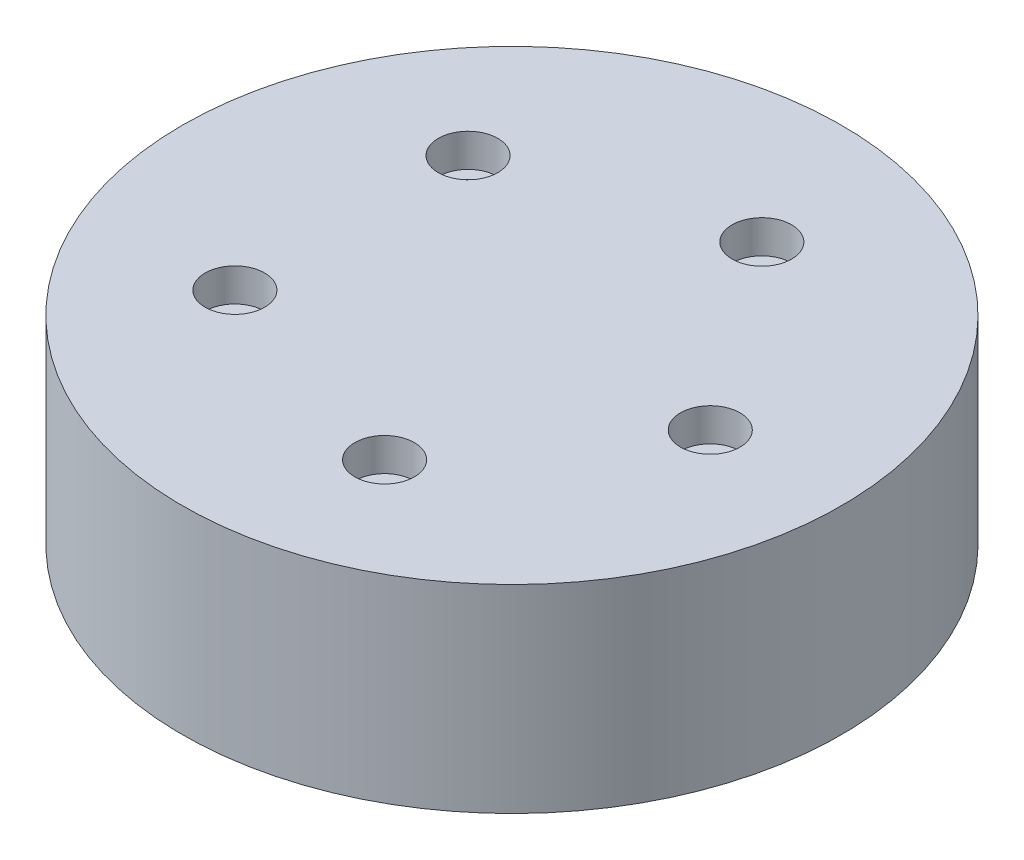
ISO-10303-21;
HEADER;
FILE_DESCRIPTION(('STEP AP214'),'2;1');
FILE_NAME('part.step','',(''),(''),'','','');
FILE_SCHEMA(('AUTOMOTIVE_DESIGN { 1 0 10303 214 1 1 1 1 }'));
ENDSEC;
DATA;
#1=APPLICATION_CONTEXT('core data for automotive mechanical design processes');
#2=APPLICATION_PROTOCOL_DEFINITION('international standard','automotive_design',2000,#1);
#3=PRODUCT_CONTEXT('',#1,'mechanical');
#4=PRODUCT('Part','Part','',(#3));
#5=PRODUCT_RELATED_PRODUCT_CATEGORY('part','',(#4));
#6=PRODUCT_DEFINITION_FORMATION('','',#4);
#7=PRODUCT_DEFINITION_CONTEXT('part definition',#1,'design');
#8=PRODUCT_DEFINITION('design','',#6,#7);
#9=PRODUCT_DEFINITION_SHAPE('','',#8);
#10=(LENGTH_UNIT() NAMED_UNIT(*) SI_UNIT(.MILLI.,.METRE.));
#11=(NAMED_UNIT(*) PLANE_ANGLE_UNIT() SI_UNIT($,.RADIAN.));
#12=(NAMED_UNIT(*) SI_UNIT($,.STERADIAN.) SOLID_ANGLE_UNIT());
#13=UNCERTAINTY_MEASURE_WITH_UNIT(LENGTH_MEASURE(1.E-05),#10,'distance_accuracy_value','');
#14=(GEOMETRIC_REPRESENTATION_CONTEXT(3) GLOBAL_UNCERTAINTY_ASSIGNED_CONTEXT((#13)) GLOBAL_UNIT_ASSIGNED_CONTEXT((#10,
#11,#12)) REPRESENTATION_CONTEXT('',''));
#15=CARTESIAN_POINT('',(0.,0.,0.));
#16=DIRECTION('',(0.,0.,1.));
#17=DIRECTION('',(1.,0.,0.));
#18=AXIS2_PLACEMENT_3D('',#15,#16,#17);
#19=CARTESIAN_POINT('',(3.4352549156516,5.,-14.265847744427));
#20=DIRECTION('',(0.,1.,0.));
#21=DIRECTION('',(-1.,0.,0.));
#22=AXIS2_PLACEMENT_3D('',#19,#20,#21);
#23=CYLINDRICAL_SURFACE('',#22,1.3);
#24=CARTESIAN_POINT('',(3.4352549156516,17.5,-14.265847744427));
#25=DIRECTION('',(0.,-1.,0.));
#26=DIRECTION('',(0.,0.,-1.));
#27=AXIS2_PLACEMENT_3D('',#24,#25,#26);
#28=CIRCLE('',#27,1.3);
#29=CARTESIAN_POINT('',(3.4352549156516,17.5,-15.565847744427));
#30=VERTEX_POINT('',#29);
#31=EDGE_CURVE('E78',#30,#30,#28,.F.);
#32=ORIENTED_EDGE('',*,*,#31,.T.);
#33=EDGE_LOOP('',(#32));
#34=FACE_BOUND('',#33,.T.);
#35=CARTESIAN_POINT('',(3.4352549156516,10.,-14.265847744427));
#36=DIRECTION('',(0.,-1.,0.));
#37=DIRECTION('',(1.,0.,0.));
#38=AXIS2_PLACEMENT_3D('',#35,#36,#37);
#39=CIRCLE('',#38,1.3);
#40=CARTESIAN_POINT('',(4.7352549156516,10.,-14.265847744427));
#41=VERTEX_POINT('',#40);
#42=EDGE_CURVE('E55',#41,#41,#39,.F.);
#43=ORIENTED_EDGE('',*,*,#42,.F.);
#44=EDGE_LOOP('',(#43));
#45=FACE_BOUND('',#44,.T.);
#46=ADVANCED_FACE('F39',(#34,#45),#23,.F.);
#47=CARTESIAN_POINT('',(13.8000000000276,5.,0.));
#48=DIRECTION('',(0.,1.,0.));
#49=DIRECTION('',(-1.,0.,0.));
#50=AXIS2_PLACEMENT_3D('',#47,#48,#49);
#51=CYLINDRICAL_SURFACE('',#50,1.3);
#52=CARTESIAN_POINT('',(13.8000000000276,17.5,0.));
#53=DIRECTION('',(0.,-1.,0.));
#54=DIRECTION('',(0.,0.,-1.));
#55=AXIS2_PLACEMENT_3D('',#52,#53,#54);
#56=CIRCLE('',#55,1.3);
#57=CARTESIAN_POINT('',(13.8000000000276,17.5,-1.3));
#58=VERTEX_POINT('',#57);
#59=EDGE_CURVE('E43',#58,#58,#56,.F.);
#60=ORIENTED_EDGE('',*,*,#59,.T.);
#61=EDGE_LOOP('',(#60));
#62=FACE_BOUND('',#61,.T.);
#63=CARTESIAN_POINT('',(13.8000000000276,10.,0.));
#64=DIRECTION('',(0.,-1.,0.));
#65=DIRECTION('',(1.,0.,0.));
#66=AXIS2_PLACEMENT_3D('',#63,#64,#65);
#67=CIRCLE('',#66,1.3);
#68=CARTESIAN_POINT('',(15.1000000000276,10.,0.));
#69=VERTEX_POINT('',#68);
#70=EDGE_CURVE('E66',#69,#69,#67,.F.);
#71=ORIENTED_EDGE('',*,*,#70,.F.);
#72=EDGE_LOOP('',(#71));
#73=FACE_BOUND('',#72,.T.);
#74=ADVANCED_FACE('F161',(#62,#73),#51,.F.);
#75=CARTESIAN_POINT('',(3.43525491565219,5.,14.2658477444276));
#76=DIRECTION('',(0.,1.,0.));
#77=DIRECTION('',(-1.,0.,0.));
#78=AXIS2_PLACEMENT_3D('',#75,#76,#77);
#79=CYLINDRICAL_SURFACE('',#78,1.3);
#80=CARTESIAN_POINT('',(3.4352549156522,17.5,14.2658477444276));
#81=DIRECTION('',(0.,-1.,0.));
#82=DIRECTION('',(0.,0.,-1.));
#83=AXIS2_PLACEMENT_3D('',#80,#81,#82);
#84=CIRCLE('',#83,1.3);
#85=CARTESIAN_POINT('',(3.4352549156522,17.5,12.9658477444276));
#86=VERTEX_POINT('',#85);
#87=EDGE_CURVE('E84',#86,#86,#84,.F.);
#88=ORIENTED_EDGE('',*,*,#87,.T.);
#89=EDGE_LOOP('',(#88));
#90=FACE_BOUND('',#89,.T.);
#91=CARTESIAN_POINT('',(3.43525491565219,10.,14.2658477444276));
#92=DIRECTION('',(0.,-1.,0.));
#93=DIRECTION('',(1.,0.,0.));
#94=AXIS2_PLACEMENT_3D('',#91,#92,#93);
#95=CIRCLE('',#94,1.3);
#96=CARTESIAN_POINT('',(4.73525491565219,10.,14.2658477444276));
#97=VERTEX_POINT('',#96);
#98=EDGE_CURVE('E62',#97,#97,#95,.F.);
#99=ORIENTED_EDGE('',*,*,#98,.F.);
#100=EDGE_LOOP('',(#99));
#101=FACE_BOUND('',#100,.T.);
#102=ADVANCED_FACE('F169',(#90,#101),#79,.F.);
#103=CARTESIAN_POINT('',(-13.3352549155966,5.,8.8167787843871));
#104=DIRECTION('',(0.,1.,0.));
#105=DIRECTION('',(-1.,0.,0.));
#106=AXIS2_PLACEMENT_3D('',#103,#104,#105);
#107=CYLINDRICAL_SURFACE('',#106,1.3);
#108=CARTESIAN_POINT('',(-13.3352549155966,17.5,8.8167787843871));
#109=DIRECTION('',(0.,-1.,0.));
#110=DIRECTION('',(0.,0.,-1.));
#111=AXIS2_PLACEMENT_3D('',#108,#109,#110);
#112=CIRCLE('',#111,1.3);
#113=CARTESIAN_POINT('',(-13.3352549155966,17.5,7.5167787843871));
#114=VERTEX_POINT('',#113);
#115=EDGE_CURVE('E81',#114,#114,#112,.F.);
#116=ORIENTED_EDGE('',*,*,#115,.T.);
#117=EDGE_LOOP('',(#116));
#118=FACE_BOUND('',#117,.T.);
#119=CARTESIAN_POINT('',(-13.3352549155966,10.,8.8167787843871));
#120=DIRECTION('',(0.,-1.,0.));
#121=DIRECTION('',(1.,0.,0.));
#122=AXIS2_PLACEMENT_3D('',#119,#120,#121);
#123=CIRCLE('',#122,1.3);
#124=CARTESIAN_POINT('',(-12.0352549155966,10.,8.8167787843871));
#125=VERTEX_POINT('',#124);
#126=EDGE_CURVE('E56',#125,#125,#123,.F.);
#127=ORIENTED_EDGE('',*,*,#126,.F.);
#128=EDGE_LOOP('',(#127));
#129=FACE_BOUND('',#128,.T.);
#130=ADVANCED_FACE('F175',(#118,#129),#107,.F.);
#131=CARTESIAN_POINT('',(-13.3352549155966,5.,-8.81677878438709));
#132=DIRECTION('',(0.,1.,0.));
#133=DIRECTION('',(-1.,0.,0.));
#134=AXIS2_PLACEMENT_3D('',#131,#132,#133);
#135=CYLINDRICAL_SURFACE('',#134,1.3);
#136=CARTESIAN_POINT('',(-13.3352549155966,17.5,-8.81677878438709));
#137=DIRECTION('',(0.,-1.,0.));
#138=DIRECTION('',(0.,0.,-1.));
#139=AXIS2_PLACEMENT_3D('',#136,#137,#138);
#140=CIRCLE('',#139,1.3);
#141=CARTESIAN_POINT('',(-13.3352549155966,17.5,-10.1167787843871));
#142=VERTEX_POINT('',#141);
#143=EDGE_CURVE('E72',#142,#142,#140,.F.);
#144=ORIENTED_EDGE('',*,*,#143,.T.);
#145=EDGE_LOOP('',(#144));
#146=FACE_BOUND('',#145,.T.);
#147=CARTESIAN_POINT('',(-13.3352549155966,10.,-8.81677878438709));
#148=DIRECTION('',(0.,-1.,0.));
#149=DIRECTION('',(1.,0.,0.));
#150=AXIS2_PLACEMENT_3D('',#147,#148,#149);
#151=CIRCLE('',#150,1.3);
#152=CARTESIAN_POINT('',(-12.0352549155966,10.,-8.81677878438709));
#153=VERTEX_POINT('',#152);
#154=EDGE_CURVE('E57',#153,#153,#151,.F.);
#155=ORIENTED_EDGE('',*,*,#154,.F.);
#156=EDGE_LOOP('',(#155));
#157=FACE_BOUND('',#156,.T.);
#158=ADVANCED_FACE('F41',(#146,#157),#135,.F.);
#159=CARTESIAN_POINT('',(-1.19999999997238,5.,0.));
#160=DIRECTION('',(0.,1.,0.));
#161=DIRECTION('',(-1.,0.,0.));
#162=AXIS2_PLACEMENT_3D('',#159,#160,#161);
#163=CYLINDRICAL_SURFACE('',#162,24.925);
#164=CARTESIAN_POINT('',(-1.19999999997238,5.,0.));
#165=DIRECTION('',(0.,1.,0.));
#166=DIRECTION('',(-1.,0.,0.));
#167=AXIS2_PLACEMENT_3D('',#164,#165,#166);
#168=CIRCLE('',#167,24.925);
#169=CARTESIAN_POINT('',(-26.1249999999724,5.,0.));
#170=VERTEX_POINT('',#169);
#171=EDGE_CURVE('E10',#170,#170,#168,.T.);
#172=ORIENTED_EDGE('',*,*,#171,.T.);
#173=EDGE_LOOP('',(#172));
#174=FACE_BOUND('',#173,.T.);
#175=CARTESIAN_POINT('',(-1.19999999997238,20.,0.));
#176=DIRECTION('',(0.,1.,0.));
#177=DIRECTION('',(-1.,0.,0.));
#178=AXIS2_PLACEMENT_3D('',#175,#176,#177);
#179=CIRCLE('',#178,24.925);
#180=CARTESIAN_POINT('',(-26.1249999999724,20.,0.));
#181=VERTEX_POINT('',#180);
#182=EDGE_CURVE('E50',#181,#181,#179,.T.);
#183=ORIENTED_EDGE('',*,*,#182,.F.);
#184=EDGE_LOOP('',(#183));
#185=FACE_BOUND('',#184,.T.);
#186=ADVANCED_FACE('F148',(#174,#185),#163,.T.);
#187=CARTESIAN_POINT('',(0.,5.,0.));
#188=DIRECTION('',(0.,1.,0.));
#189=DIRECTION('',(-1.,0.,0.));
#190=AXIS2_PLACEMENT_3D('',#187,#188,#189);
#191=PLANE('',#190);
#192=CARTESIAN_POINT('',(3.43525491574279,5.,-14.2658477443021));
#193=DIRECTION('',(0.,-1.,0.));
#194=DIRECTION('',(1.,0.,0.));
#195=AXIS2_PLACEMENT_3D('',#192,#193,#194);
#196=CIRCLE('',#195,1.65);
#197=CARTESIAN_POINT('',(5.08525491574279,5.,-14.2658477443021));
#198=VERTEX_POINT('',#197);
#199=EDGE_CURVE('E133',#198,#198,#196,.T.);
#200=ORIENTED_EDGE('',*,*,#199,.F.);
#201=EDGE_LOOP('',(#200));
#202=FACE_BOUND('',#201,.T.);
#203=CARTESIAN_POINT('',(-13.3352549153584,5.,-8.81677878430962));
#204=DIRECTION('',(0.,-1.,0.));
#205=DIRECTION('',(1.,0.,0.));
#206=AXIS2_PLACEMENT_3D('',#203,#204,#205);
#207=CIRCLE('',#206,1.65);
#208=CARTESIAN_POINT('',(-11.6852549153584,5.,-8.81677878430962));
#209=VERTEX_POINT('',#208);
#210=EDGE_CURVE('E124',#209,#209,#207,.T.);
#211=ORIENTED_EDGE('',*,*,#210,.F.);
#212=EDGE_LOOP('',(#211));
#213=FACE_BOUND('',#212,.T.);
#214=CARTESIAN_POINT('',(13.8000000000276,5.,0.));
#215=DIRECTION('',(0.,-1.,0.));
#216=DIRECTION('',(1.,0.,0.));
#217=AXIS2_PLACEMENT_3D('',#214,#215,#216);
#218=CIRCLE('',#217,1.65);
#219=CARTESIAN_POINT('',(15.4500000000276,5.,0.));
#220=VERTEX_POINT('',#219);
#221=EDGE_CURVE('E120',#220,#220,#218,.T.);
#222=ORIENTED_EDGE('',*,*,#221,.F.);
#223=EDGE_LOOP('',(#222));
#224=FACE_BOUND('',#223,.T.);
#225=CARTESIAN_POINT('',(3.43525491574299,5.,14.265847744302));
#226=DIRECTION('',(0.,-1.,0.));
#227=DIRECTION('',(1.,0.,0.));
#228=AXIS2_PLACEMENT_3D('',#225,#226,#227);
#229=CIRCLE('',#228,1.65);
#230=CARTESIAN_POINT('',(5.08525491574299,5.,14.265847744302));
#231=VERTEX_POINT('',#230);
#232=EDGE_CURVE('E115',#231,#231,#229,.T.);
#233=ORIENTED_EDGE('',*,*,#232,.F.);
#234=EDGE_LOOP('',(#233));
#235=FACE_BOUND('',#234,.T.);
#236=CARTESIAN_POINT('',(-13.3352549153583,5.,8.81677878430981));
#237=DIRECTION('',(0.,-1.,0.));
#238=DIRECTION('',(1.,0.,0.));
#239=AXIS2_PLACEMENT_3D('',#236,#237,#238);
#240=CIRCLE('',#239,1.65);
#241=CARTESIAN_POINT('',(-11.6852549153583,5.,8.81677878430981));
#242=VERTEX_POINT('',#241);
#243=EDGE_CURVE('E113',#242,#242,#240,.T.);
#244=ORIENTED_EDGE('',*,*,#243,.F.);
#245=EDGE_LOOP('',(#244));
#246=FACE_BOUND('',#245,.T.);
#247=ORIENTED_EDGE('',*,*,#171,.F.);
#248=EDGE_LOOP('',(#247));
#249=FACE_BOUND('',#248,.T.);
#250=ADVANCED_FACE('F142',(#202,#213,#224,#235,#246,#249),#191,.F.);
#251=CARTESIAN_POINT('',(0.,20.,0.));
#252=DIRECTION('',(0.,1.,0.));
#253=DIRECTION('',(-1.,0.,0.));
#254=AXIS2_PLACEMENT_3D('',#251,#252,#253);
#255=PLANE('',#254);
#256=CARTESIAN_POINT('',(13.8000000000276,20.,0.));
#257=DIRECTION('',(0.,1.,0.));
#258=DIRECTION('',(0.,0.,1.));
#259=AXIS2_PLACEMENT_3D('',#256,#257,#258);
#260=CIRCLE('',#259,2.25);
#261=CARTESIAN_POINT('',(13.8000000000276,20.,2.25));
#262=VERTEX_POINT('',#261);
#263=EDGE_CURVE('E269',#262,#262,#260,.T.);
#264=ORIENTED_EDGE('',*,*,#263,.F.);
#265=EDGE_LOOP('',(#264));
#266=FACE_BOUND('',#265,.T.);
#267=CARTESIAN_POINT('',(3.4352549156522,20.,14.2658477444276));
#268=DIRECTION('',(0.,1.,0.));
#269=DIRECTION('',(0.,0.,1.));
#270=AXIS2_PLACEMENT_3D('',#267,#268,#269);
#271=CIRCLE('',#270,2.25);
#272=CARTESIAN_POINT('',(3.4352549156522,20.,16.5158477444276));
#273=VERTEX_POINT('',#272);
#274=EDGE_CURVE('E94',#273,#273,#271,.T.);
#275=ORIENTED_EDGE('',*,*,#274,.F.);
#276=EDGE_LOOP('',(#275));
#277=FACE_BOUND('',#276,.T.);
#278=CARTESIAN_POINT('',(-13.3352549155966,20.,8.8167787843871));
#279=DIRECTION('',(0.,1.,0.));
#280=DIRECTION('',(0.,0.,1.));
#281=AXIS2_PLACEMENT_3D('',#278,#279,#280);
#282=CIRCLE('',#281,2.25);
#283=CARTESIAN_POINT('',(-13.3352549155966,20.,11.0667787843871));
#284=VERTEX_POINT('',#283);
#285=EDGE_CURVE('E87',#284,#284,#282,.T.);
#286=ORIENTED_EDGE('',*,*,#285,.F.);
#287=EDGE_LOOP('',(#286));
#288=FACE_BOUND('',#287,.T.);
#289=CARTESIAN_POINT('',(3.4352549156516,20.,-14.265847744427));
#290=DIRECTION('',(0.,1.,0.));
#291=DIRECTION('',(0.,0.,1.));
#292=AXIS2_PLACEMENT_3D('',#289,#290,#291);
#293=CIRCLE('',#292,2.25);
#294=CARTESIAN_POINT('',(3.4352549156516,20.,-12.015847744427));
#295=VERTEX_POINT('',#294);
#296=EDGE_CURVE('E83',#295,#295,#293,.T.);
#297=ORIENTED_EDGE('',*,*,#296,.F.);
#298=EDGE_LOOP('',(#297));
#299=FACE_BOUND('',#298,.T.);
#300=CARTESIAN_POINT('',(-13.3352549155966,20.,-8.81677878438709));
#301=DIRECTION('',(0.,1.,0.));
#302=DIRECTION('',(0.,0.,1.));
#303=AXIS2_PLACEMENT_3D('',#300,#301,#302);
#304=CIRCLE('',#303,2.25);
#305=CARTESIAN_POINT('',(-13.3352549155966,20.,-6.56677878438709));
#306=VERTEX_POINT('',#305);
#307=EDGE_CURVE('E80',#306,#306,#304,.T.);
#308=ORIENTED_EDGE('',*,*,#307,.F.);
#309=EDGE_LOOP('',(#308));
#310=FACE_BOUND('',#309,.T.);
#311=ORIENTED_EDGE('',*,*,#182,.T.);
#312=EDGE_LOOP('',(#311));
#313=FACE_BOUND('',#312,.T.);
#314=ADVANCED_FACE('F144',(#266,#277,#288,#299,#310,#313),#255,.T.);
#315=CARTESIAN_POINT('',(-13.3352549153583,10.,8.81677878430981));
#316=DIRECTION('',(0.,-1.,0.));
#317=DIRECTION('',(1.,0.,0.));
#318=AXIS2_PLACEMENT_3D('',#315,#316,#317);
#319=PLANE('',#318);
#320=CARTESIAN_POINT('',(-13.3352549153583,10.,8.81677878430981));
#321=DIRECTION('',(0.,-1.,0.));
#322=DIRECTION('',(1.,0.,0.));
#323=AXIS2_PLACEMENT_3D('',#320,#321,#322);
#324=CIRCLE('',#323,1.65);
#325=CARTESIAN_POINT('',(-11.6852549153583,10.,8.81677878430981));
#326=VERTEX_POINT('',#325);
#327=EDGE_CURVE('E58',#326,#326,#324,.T.);
#328=ORIENTED_EDGE('',*,*,#327,.T.);
#329=EDGE_LOOP('',(#328));
#330=FACE_BOUND('',#329,.T.);
#331=ORIENTED_EDGE('',*,*,#126,.T.);
#332=EDGE_LOOP('',(#331));
#333=FACE_BOUND('',#332,.T.);
#334=ADVANCED_FACE('F152',(#330,#333),#319,.T.);
#335=CARTESIAN_POINT('',(-13.3352549153583,10.,8.81677878430981));
#336=DIRECTION('',(0.,-1.,0.));
#337=DIRECTION('',(1.,0.,0.));
#338=AXIS2_PLACEMENT_3D('',#335,#336,#337);
#339=CYLINDRICAL_SURFACE('',#338,1.65);
#340=ORIENTED_EDGE('',*,*,#327,.F.);
#341=EDGE_LOOP('',(#340));
#342=FACE_BOUND('',#341,.T.);
#343=ORIENTED_EDGE('',*,*,#243,.T.);
#344=EDGE_LOOP('',(#343));
#345=FACE_BOUND('',#344,.T.);
#346=ADVANCED_FACE('F139',(#342,#345),#339,.F.);
#347=CARTESIAN_POINT('',(3.43525491574299,10.,14.265847744302));
#348=DIRECTION('',(0.,-1.,0.));
#349=DIRECTION('',(1.,0.,0.));
#350=AXIS2_PLACEMENT_3D('',#347,#348,#349);
#351=PLANE('',#350);
#352=CARTESIAN_POINT('',(3.43525491574299,10.,14.265847744302));
#353=DIRECTION('',(0.,-1.,0.));
#354=DIRECTION('',(1.,0.,0.));
#355=AXIS2_PLACEMENT_3D('',#352,#353,#354);
#356=CIRCLE('',#355,1.65);
#357=CARTESIAN_POINT('',(5.08525491574299,10.,14.265847744302));
#358=VERTEX_POINT('',#357);
#359=EDGE_CURVE('E118',#358,#358,#356,.T.);
#360=ORIENTED_EDGE('',*,*,#359,.T.);
#361=EDGE_LOOP('',(#360));
#362=FACE_BOUND('',#361,.T.);
#363=ORIENTED_EDGE('',*,*,#98,.T.);
#364=EDGE_LOOP('',(#363));
#365=FACE_BOUND('',#364,.T.);
#366=ADVANCED_FACE('F186',(#362,#365),#351,.T.);
#367=CARTESIAN_POINT('',(3.43525491574299,10.,14.265847744302));
#368=DIRECTION('',(0.,-1.,0.));
#369=DIRECTION('',(1.,0.,0.));
#370=AXIS2_PLACEMENT_3D('',#367,#368,#369);
#371=CYLINDRICAL_SURFACE('',#370,1.65);
#372=ORIENTED_EDGE('',*,*,#359,.F.);
#373=EDGE_LOOP('',(#372));
#374=FACE_BOUND('',#373,.T.);
#375=ORIENTED_EDGE('',*,*,#232,.T.);
#376=EDGE_LOOP('',(#375));
#377=FACE_BOUND('',#376,.T.);
#378=ADVANCED_FACE('F212',(#374,#377),#371,.F.);
#379=CARTESIAN_POINT('',(13.8000000000276,10.,0.));
#380=DIRECTION('',(0.,-1.,0.));
#381=DIRECTION('',(1.,0.,0.));
#382=AXIS2_PLACEMENT_3D('',#379,#380,#381);
#383=PLANE('',#382);
#384=CARTESIAN_POINT('',(13.8000000000276,10.,0.));
#385=DIRECTION('',(0.,-1.,0.));
#386=DIRECTION('',(1.,0.,0.));
#387=AXIS2_PLACEMENT_3D('',#384,#385,#386);
#388=CIRCLE('',#387,1.65);
#389=CARTESIAN_POINT('',(15.4500000000276,10.,0.));
#390=VERTEX_POINT('',#389);
#391=EDGE_CURVE('E125',#390,#390,#388,.T.);
#392=ORIENTED_EDGE('',*,*,#391,.T.);
#393=EDGE_LOOP('',(#392));
#394=FACE_BOUND('',#393,.T.);
#395=ORIENTED_EDGE('',*,*,#70,.T.);
#396=EDGE_LOOP('',(#395));
#397=FACE_BOUND('',#396,.T.);
#398=ADVANCED_FACE('F211',(#394,#397),#383,.T.);
#399=CARTESIAN_POINT('',(13.8000000000276,10.,0.));
#400=DIRECTION('',(0.,-1.,0.));
#401=DIRECTION('',(1.,0.,0.));
#402=AXIS2_PLACEMENT_3D('',#399,#400,#401);
#403=CYLINDRICAL_SURFACE('',#402,1.65);
#404=ORIENTED_EDGE('',*,*,#391,.F.);
#405=EDGE_LOOP('',(#404));
#406=FACE_BOUND('',#405,.T.);
#407=ORIENTED_EDGE('',*,*,#221,.T.);
#408=EDGE_LOOP('',(#407));
#409=FACE_BOUND('',#408,.T.);
#410=ADVANCED_FACE('F206',(#406,#409),#403,.F.);
#411=CARTESIAN_POINT('',(-13.3352549153584,10.,-8.81677878430962));
#412=DIRECTION('',(0.,-1.,0.));
#413=DIRECTION('',(1.,0.,0.));
#414=AXIS2_PLACEMENT_3D('',#411,#412,#413);
#415=PLANE('',#414);
#416=CARTESIAN_POINT('',(-13.3352549153584,10.,-8.81677878430962));
#417=DIRECTION('',(0.,-1.,0.));
#418=DIRECTION('',(1.,0.,0.));
#419=AXIS2_PLACEMENT_3D('',#416,#417,#418);
#420=CIRCLE('',#419,1.65);
#421=CARTESIAN_POINT('',(-11.6852549153584,10.,-8.81677878430962));
#422=VERTEX_POINT('',#421);
#423=EDGE_CURVE('E126',#422,#422,#420,.T.);
#424=ORIENTED_EDGE('',*,*,#423,.T.);
#425=EDGE_LOOP('',(#424));
#426=FACE_BOUND('',#425,.T.);
#427=ORIENTED_EDGE('',*,*,#154,.T.);
#428=EDGE_LOOP('',(#427));
#429=FACE_BOUND('',#428,.T.);
#430=ADVANCED_FACE('F201',(#426,#429),#415,.T.);
#431=CARTESIAN_POINT('',(-13.3352549153584,10.,-8.81677878430962));
#432=DIRECTION('',(0.,-1.,0.));
#433=DIRECTION('',(1.,0.,0.));
#434=AXIS2_PLACEMENT_3D('',#431,#432,#433);
#435=CYLINDRICAL_SURFACE('',#434,1.65);
#436=ORIENTED_EDGE('',*,*,#423,.F.);
#437=EDGE_LOOP('',(#436));
#438=FACE_BOUND('',#437,.T.);
#439=ORIENTED_EDGE('',*,*,#210,.T.);
#440=EDGE_LOOP('',(#439));
#441=FACE_BOUND('',#440,.T.);
#442=ADVANCED_FACE('F196',(#438,#441),#435,.F.);
#443=CARTESIAN_POINT('',(3.43525491574279,10.,-14.2658477443021));
#444=DIRECTION('',(0.,-1.,0.));
#445=DIRECTION('',(1.,0.,0.));
#446=AXIS2_PLACEMENT_3D('',#443,#444,#445);
#447=PLANE('',#446);
#448=CARTESIAN_POINT('',(3.43525491574279,10.,-14.2658477443021));
#449=DIRECTION('',(0.,-1.,0.));
#450=DIRECTION('',(1.,0.,0.));
#451=AXIS2_PLACEMENT_3D('',#448,#449,#450);
#452=CIRCLE('',#451,1.65);
#453=CARTESIAN_POINT('',(5.08525491574279,10.,-14.2658477443021));
#454=VERTEX_POINT('',#453);
#455=EDGE_CURVE('E74',#454,#454,#452,.T.);
#456=ORIENTED_EDGE('',*,*,#455,.T.);
#457=EDGE_LOOP('',(#456));
#458=FACE_BOUND('',#457,.T.);
#459=ORIENTED_EDGE('',*,*,#42,.T.);
#460=EDGE_LOOP('',(#459));
#461=FACE_BOUND('',#460,.T.);
#462=ADVANCED_FACE('F192',(#458,#461),#447,.T.);
#463=CARTESIAN_POINT('',(3.43525491574279,10.,-14.2658477443021));
#464=DIRECTION('',(0.,-1.,0.));
#465=DIRECTION('',(1.,0.,0.));
#466=AXIS2_PLACEMENT_3D('',#463,#464,#465);
#467=CYLINDRICAL_SURFACE('',#466,1.65);
#468=ORIENTED_EDGE('',*,*,#455,.F.);
#469=EDGE_LOOP('',(#468));
#470=FACE_BOUND('',#469,.T.);
#471=ORIENTED_EDGE('',*,*,#199,.T.);
#472=EDGE_LOOP('',(#471));
#473=FACE_BOUND('',#472,.T.);
#474=ADVANCED_FACE('F197',(#470,#473),#467,.F.);
#475=CARTESIAN_POINT('',(-12.0852549155966,17.5,-8.81677878438709));
#476=DIRECTION('',(0.,-1.,0.));
#477=DIRECTION('',(0.,0.,-1.));
#478=AXIS2_PLACEMENT_3D('',#475,#476,#477);
#479=PLANE('',#478);
#480=CARTESIAN_POINT('',(-13.3352549155966,17.5,-8.81677878438709));
#481=DIRECTION('',(0.,1.,0.));
#482=DIRECTION('',(0.,0.,1.));
#483=AXIS2_PLACEMENT_3D('',#480,#481,#482);
#484=CIRCLE('',#483,2.25);
#485=CARTESIAN_POINT('',(-13.3352549155966,17.5,-6.56677878438709));
#486=VERTEX_POINT('',#485);
#487=EDGE_CURVE('E73',#486,#486,#484,.T.);
#488=ORIENTED_EDGE('',*,*,#487,.T.);
#489=EDGE_LOOP('',(#488));
#490=FACE_BOUND('',#489,.T.);
#491=ORIENTED_EDGE('',*,*,#143,.F.);
#492=EDGE_LOOP('',(#491));
#493=FACE_BOUND('',#492,.T.);
#494=ADVANCED_FACE('F203',(#490,#493),#479,.F.);
#495=CARTESIAN_POINT('',(-13.3352549155966,20.,-8.81677878438709));
#496=DIRECTION('',(0.,1.,0.));
#497=DIRECTION('',(0.,0.,1.));
#498=AXIS2_PLACEMENT_3D('',#495,#496,#497);
#499=CYLINDRICAL_SURFACE('',#498,2.25);
#500=ORIENTED_EDGE('',*,*,#487,.F.);
#501=EDGE_LOOP('',(#500));
#502=FACE_BOUND('',#501,.T.);
#503=ORIENTED_EDGE('',*,*,#307,.T.);
#504=EDGE_LOOP('',(#503));
#505=FACE_BOUND('',#504,.T.);
#506=ADVANCED_FACE('F229',(#502,#505),#499,.F.);
#507=CARTESIAN_POINT('',(4.68525491565161,17.5,-14.265847744427));
#508=DIRECTION('',(0.,-1.,0.));
#509=DIRECTION('',(0.,0.,-1.));
#510=AXIS2_PLACEMENT_3D('',#507,#508,#509);
#511=PLANE('',#510);
#512=CARTESIAN_POINT('',(3.4352549156516,17.5,-14.265847744427));
#513=DIRECTION('',(0.,1.,0.));
#514=DIRECTION('',(0.,0.,1.));
#515=AXIS2_PLACEMENT_3D('',#512,#513,#514);
#516=CIRCLE('',#515,2.25);
#517=CARTESIAN_POINT('',(3.4352549156516,17.5,-12.015847744427));
#518=VERTEX_POINT('',#517);
#519=EDGE_CURVE('E76',#518,#518,#516,.T.);
#520=ORIENTED_EDGE('',*,*,#519,.T.);
#521=EDGE_LOOP('',(#520));
#522=FACE_BOUND('',#521,.T.);
#523=ORIENTED_EDGE('',*,*,#31,.F.);
#524=EDGE_LOOP('',(#523));
#525=FACE_BOUND('',#524,.T.);
#526=ADVANCED_FACE('F231',(#522,#525),#511,.F.);
#527=CARTESIAN_POINT('',(3.4352549156516,20.,-14.265847744427));
#528=DIRECTION('',(0.,1.,0.));
#529=DIRECTION('',(0.,0.,1.));
#530=AXIS2_PLACEMENT_3D('',#527,#528,#529);
#531=CYLINDRICAL_SURFACE('',#530,2.25);
#532=ORIENTED_EDGE('',*,*,#519,.F.);
#533=EDGE_LOOP('',(#532));
#534=FACE_BOUND('',#533,.T.);
#535=ORIENTED_EDGE('',*,*,#296,.T.);
#536=EDGE_LOOP('',(#535));
#537=FACE_BOUND('',#536,.T.);
#538=ADVANCED_FACE('F234',(#534,#537),#531,.F.);
#539=CARTESIAN_POINT('',(-12.0852549155966,17.5,8.8167787843871));
#540=DIRECTION('',(0.,-1.,0.));
#541=DIRECTION('',(0.,0.,-1.));
#542=AXIS2_PLACEMENT_3D('',#539,#540,#541);
#543=PLANE('',#542);
#544=CARTESIAN_POINT('',(-13.3352549155966,17.5,8.8167787843871));
#545=DIRECTION('',(0.,1.,0.));
#546=DIRECTION('',(0.,0.,1.));
#547=AXIS2_PLACEMENT_3D('',#544,#545,#546);
#548=CIRCLE('',#547,2.25);
#549=CARTESIAN_POINT('',(-13.3352549155966,17.5,11.0667787843871));
#550=VERTEX_POINT('',#549);
#551=EDGE_CURVE('E82',#550,#550,#548,.T.);
#552=ORIENTED_EDGE('',*,*,#551,.T.);
#553=EDGE_LOOP('',(#552));
#554=FACE_BOUND('',#553,.T.);
#555=ORIENTED_EDGE('',*,*,#115,.F.);
#556=EDGE_LOOP('',(#555));
#557=FACE_BOUND('',#556,.T.);
#558=ADVANCED_FACE('F239',(#554,#557),#543,.F.);
#559=CARTESIAN_POINT('',(-13.3352549155966,20.,8.8167787843871));
#560=DIRECTION('',(0.,1.,0.));
#561=DIRECTION('',(0.,0.,1.));
#562=AXIS2_PLACEMENT_3D('',#559,#560,#561);
#563=CYLINDRICAL_SURFACE('',#562,2.25);
#564=ORIENTED_EDGE('',*,*,#551,.F.);
#565=EDGE_LOOP('',(#564));
#566=FACE_BOUND('',#565,.T.);
#567=ORIENTED_EDGE('',*,*,#285,.T.);
#568=EDGE_LOOP('',(#567));
#569=FACE_BOUND('',#568,.T.);
#570=ADVANCED_FACE('F242',(#566,#569),#563,.F.);
#571=CARTESIAN_POINT('',(4.6852549156522,17.5,14.2658477444276));
#572=DIRECTION('',(0.,-1.,0.));
#573=DIRECTION('',(0.,0.,-1.));
#574=AXIS2_PLACEMENT_3D('',#571,#572,#573);
#575=PLANE('',#574);
#576=CARTESIAN_POINT('',(3.4352549156522,17.5,14.2658477444276));
#577=DIRECTION('',(0.,1.,0.));
#578=DIRECTION('',(0.,0.,1.));
#579=AXIS2_PLACEMENT_3D('',#576,#577,#578);
#580=CIRCLE('',#579,2.25);
#581=CARTESIAN_POINT('',(3.4352549156522,17.5,16.5158477444276));
#582=VERTEX_POINT('',#581);
#583=EDGE_CURVE('E86',#582,#582,#580,.T.);
#584=ORIENTED_EDGE('',*,*,#583,.T.);
#585=EDGE_LOOP('',(#584));
#586=FACE_BOUND('',#585,.T.);
#587=ORIENTED_EDGE('',*,*,#87,.F.);
#588=EDGE_LOOP('',(#587));
#589=FACE_BOUND('',#588,.T.);
#590=ADVANCED_FACE('F250',(#586,#589),#575,.F.);
#591=CARTESIAN_POINT('',(3.4352549156522,20.,14.2658477444276));
#592=DIRECTION('',(0.,1.,0.));
#593=DIRECTION('',(0.,0.,1.));
#594=AXIS2_PLACEMENT_3D('',#591,#592,#593);
#595=CYLINDRICAL_SURFACE('',#594,2.25);
#596=ORIENTED_EDGE('',*,*,#583,.F.);
#597=EDGE_LOOP('',(#596));
#598=FACE_BOUND('',#597,.T.);
#599=ORIENTED_EDGE('',*,*,#274,.T.);
#600=EDGE_LOOP('',(#599));
#601=FACE_BOUND('',#600,.T.);
#602=ADVANCED_FACE('F253',(#598,#601),#595,.F.);
#603=CARTESIAN_POINT('',(15.0500000000276,17.5,0.));
#604=DIRECTION('',(0.,-1.,0.));
#605=DIRECTION('',(0.,0.,-1.));
#606=AXIS2_PLACEMENT_3D('',#603,#604,#605);
#607=PLANE('',#606);
#608=CARTESIAN_POINT('',(13.8000000000276,17.5,0.));
#609=DIRECTION('',(0.,1.,0.));
#610=DIRECTION('',(0.,0.,1.));
#611=AXIS2_PLACEMENT_3D('',#608,#609,#610);
#612=CIRCLE('',#611,2.25);
#613=CARTESIAN_POINT('',(13.8000000000276,17.5,2.25));
#614=VERTEX_POINT('',#613);
#615=EDGE_CURVE('E270',#614,#614,#612,.T.);
#616=ORIENTED_EDGE('',*,*,#615,.T.);
#617=EDGE_LOOP('',(#616));
#618=FACE_BOUND('',#617,.T.);
#619=ORIENTED_EDGE('',*,*,#59,.F.);
#620=EDGE_LOOP('',(#619));
#621=FACE_BOUND('',#620,.T.);
#622=ADVANCED_FACE('F255',(#618,#621),#607,.F.);
#623=CARTESIAN_POINT('',(13.8000000000276,20.,0.));
#624=DIRECTION('',(0.,1.,0.));
#625=DIRECTION('',(0.,0.,1.));
#626=AXIS2_PLACEMENT_3D('',#623,#624,#625);
#627=CYLINDRICAL_SURFACE('',#626,2.25);
#628=ORIENTED_EDGE('',*,*,#615,.F.);
#629=EDGE_LOOP('',(#628));
#630=FACE_BOUND('',#629,.T.);
#631=ORIENTED_EDGE('',*,*,#263,.T.);
#632=EDGE_LOOP('',(#631));
#633=FACE_BOUND('',#632,.T.);
#634=ADVANCED_FACE('F256',(#630,#633),#627,.F.);
#635=CLOSED_SHELL('',(#46,#74,#102,#130,#158,#186,#250,#314,#334,#346,#366,#378,#398,#410,#430,
#442,#462,#474,#494,#506,#526,#538,#558,#570,#590,#602,#622,#634));
#636=MANIFOLD_SOLID_BREP('B2',#635);
#637=ADVANCED_BREP_SHAPE_REPRESENTATION('',(#18,#636),#14);
#638=SHAPE_DEFINITION_REPRESENTATION(#9,#637);
ENDSEC;
END-ISO-10303-21;
